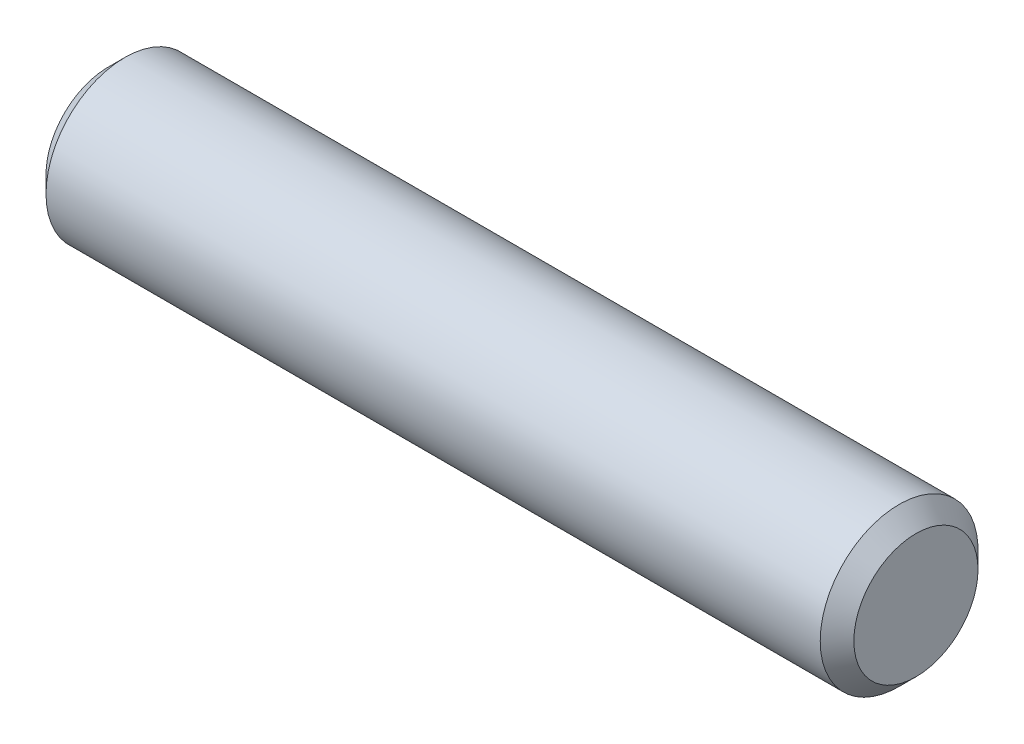
ISO-10303-21;
HEADER;
FILE_DESCRIPTION(('STEP AP214'),'2;1');
FILE_NAME('part.step','',(''),(''),'','','');
FILE_SCHEMA(('AUTOMOTIVE_DESIGN { 1 0 10303 214 1 1 1 1 }'));
ENDSEC;
DATA;
#1=APPLICATION_CONTEXT('core data for automotive mechanical design processes');
#2=APPLICATION_PROTOCOL_DEFINITION('international standard','automotive_design',2000,#1);
#3=PRODUCT_CONTEXT('',#1,'mechanical');
#4=PRODUCT('Part','Part','',(#3));
#5=PRODUCT_RELATED_PRODUCT_CATEGORY('part','',(#4));
#6=PRODUCT_DEFINITION_FORMATION('','',#4);
#7=PRODUCT_DEFINITION_CONTEXT('part definition',#1,'design');
#8=PRODUCT_DEFINITION('design','',#6,#7);
#9=PRODUCT_DEFINITION_SHAPE('','',#8);
#10=(LENGTH_UNIT() NAMED_UNIT(*) SI_UNIT(.MILLI.,.METRE.));
#11=(NAMED_UNIT(*) PLANE_ANGLE_UNIT() SI_UNIT($,.RADIAN.));
#12=(NAMED_UNIT(*) SI_UNIT($,.STERADIAN.) SOLID_ANGLE_UNIT());
#13=UNCERTAINTY_MEASURE_WITH_UNIT(LENGTH_MEASURE(1.E-05),#10,'distance_accuracy_value','');
#14=(GEOMETRIC_REPRESENTATION_CONTEXT(3) GLOBAL_UNCERTAINTY_ASSIGNED_CONTEXT((#13)) GLOBAL_UNIT_ASSIGNED_CONTEXT((#10,
#11,#12)) REPRESENTATION_CONTEXT('',''));
#15=CARTESIAN_POINT('',(0.,0.,0.));
#16=DIRECTION('',(0.,0.,1.));
#17=DIRECTION('',(1.,0.,0.));
#18=AXIS2_PLACEMENT_3D('',#15,#16,#17);
#19=CARTESIAN_POINT('',(6.096,0.,0.));
#20=DIRECTION('',(-1.,0.,0.));
#21=DIRECTION('',(0.,0.,1.));
#22=AXIS2_PLACEMENT_3D('',#19,#20,#21);
#23=CYLINDRICAL_SURFACE('',#22,1.190625);
#24=CARTESIAN_POINT('',(-5.84199999999999,0.,0.));
#25=DIRECTION('',(1.,0.,0.));
#26=DIRECTION('',(0.,0.,-1.));
#27=AXIS2_PLACEMENT_3D('',#24,#25,#26);
#28=CIRCLE('',#27,1.190625);
#29=CARTESIAN_POINT('',(-5.842,0.,1.190625));
#30=VERTEX_POINT('',#29);
#31=EDGE_CURVE('E380',#30,#30,#28,.T.);
#32=CARTESIAN_POINT('',(5.842,0.,0.));
#33=DIRECTION('',(1.,0.,0.));
#34=DIRECTION('',(0.,0.,-1.));
#35=AXIS2_PLACEMENT_3D('',#32,#33,#34);
#36=CIRCLE('',#35,1.190625);
#37=CARTESIAN_POINT('',(5.842,0.,1.190625));
#38=VERTEX_POINT('',#37);
#39=EDGE_CURVE('E384',#38,#38,#36,.F.);
#40=CARTESIAN_POINT('',(-5.842,0.,1.190625));
#41=CARTESIAN_POINT('',(-5.72029166666666,0.,1.190625));
#42=CARTESIAN_POINT('',(-5.59858333333333,0.,1.190625));
#43=CARTESIAN_POINT('',(-5.35516666666666,0.,1.190625));
#44=CARTESIAN_POINT('',(-5.23345833333333,0.,1.190625));
#45=CARTESIAN_POINT('',(-4.99004166666666,0.,1.190625));
#46=CARTESIAN_POINT('',(-4.86833333333333,0.,1.190625));
#47=CARTESIAN_POINT('',(-4.62491666666666,0.,1.190625));
#48=CARTESIAN_POINT('',(-4.50320833333333,0.,1.190625));
#49=CARTESIAN_POINT('',(-4.25979166666666,0.,1.190625));
#50=CARTESIAN_POINT('',(-4.13808333333333,0.,1.190625));
#51=CARTESIAN_POINT('',(-3.89466666666666,0.,1.190625));
#52=CARTESIAN_POINT('',(-3.77295833333333,0.,1.190625));
#53=CARTESIAN_POINT('',(-3.52954166666666,0.,1.190625));
#54=CARTESIAN_POINT('',(-3.40783333333333,0.,1.190625));
#55=CARTESIAN_POINT('',(-3.16441666666666,0.,1.190625));
#56=CARTESIAN_POINT('',(-3.04270833333333,0.,1.190625));
#57=CARTESIAN_POINT('',(-2.79929166666666,0.,1.190625));
#58=CARTESIAN_POINT('',(-2.67758333333333,0.,1.190625));
#59=CARTESIAN_POINT('',(-2.43416666666666,0.,1.190625));
#60=CARTESIAN_POINT('',(-2.31245833333333,0.,1.190625));
#61=CARTESIAN_POINT('',(-2.06904166666666,0.,1.190625));
#62=CARTESIAN_POINT('',(-1.94733333333333,0.,1.190625));
#63=CARTESIAN_POINT('',(-1.70391666666666,0.,1.190625));
#64=CARTESIAN_POINT('',(-1.58220833333333,0.,1.190625));
#65=CARTESIAN_POINT('',(-1.33879166666667,0.,1.190625));
#66=CARTESIAN_POINT('',(-1.21708333333333,0.,1.190625));
#67=CARTESIAN_POINT('',(-0.973666666666665,0.,1.190625));
#68=CARTESIAN_POINT('',(-0.851958333333332,0.,1.190625));
#69=CARTESIAN_POINT('',(-0.608541666666665,0.,1.190625));
#70=CARTESIAN_POINT('',(-0.486833333333332,0.,1.190625));
#71=CARTESIAN_POINT('',(-0.243416666666665,0.,1.190625));
#72=CARTESIAN_POINT('',(-0.121708333333332,0.,1.190625));
#73=CARTESIAN_POINT('',(0.121708333333335,0.,1.190625));
#74=CARTESIAN_POINT('',(0.243416666666668,0.,1.190625));
#75=CARTESIAN_POINT('',(0.486833333333335,0.,1.190625));
#76=CARTESIAN_POINT('',(0.608541666666668,0.,1.190625));
#77=CARTESIAN_POINT('',(0.851958333333335,0.,1.190625));
#78=CARTESIAN_POINT('',(0.973666666666668,0.,1.190625));
#79=CARTESIAN_POINT('',(1.21708333333334,0.,1.190625));
#80=CARTESIAN_POINT('',(1.33879166666667,0.,1.190625));
#81=CARTESIAN_POINT('',(1.58220833333333,0.,1.190625));
#82=CARTESIAN_POINT('',(1.70391666666667,0.,1.190625));
#83=CARTESIAN_POINT('',(1.94733333333333,0.,1.190625));
#84=CARTESIAN_POINT('',(2.06904166666667,0.,1.190625));
#85=CARTESIAN_POINT('',(2.31245833333333,0.,1.190625));
#86=CARTESIAN_POINT('',(2.43416666666667,0.,1.190625));
#87=CARTESIAN_POINT('',(2.67758333333333,0.,1.190625));
#88=CARTESIAN_POINT('',(2.79929166666667,0.,1.190625));
#89=CARTESIAN_POINT('',(3.04270833333333,0.,1.190625));
#90=CARTESIAN_POINT('',(3.16441666666667,0.,1.190625));
#91=CARTESIAN_POINT('',(3.40783333333333,0.,1.190625));
#92=CARTESIAN_POINT('',(3.52954166666667,0.,1.190625));
#93=CARTESIAN_POINT('',(3.77295833333333,0.,1.190625));
#94=CARTESIAN_POINT('',(3.89466666666667,0.,1.190625));
#95=CARTESIAN_POINT('',(4.13808333333333,0.,1.190625));
#96=CARTESIAN_POINT('',(4.25979166666667,0.,1.190625));
#97=CARTESIAN_POINT('',(4.50320833333333,0.,1.190625));
#98=CARTESIAN_POINT('',(4.62491666666667,0.,1.190625));
#99=CARTESIAN_POINT('',(4.86833333333333,0.,1.190625));
#100=CARTESIAN_POINT('',(4.99004166666667,0.,1.190625));
#101=CARTESIAN_POINT('',(5.23345833333333,0.,1.190625));
#102=CARTESIAN_POINT('',(5.35516666666667,0.,1.190625));
#103=CARTESIAN_POINT('',(5.59858333333333,0.,1.190625));
#104=CARTESIAN_POINT('',(5.72029166666667,0.,1.190625));
#105=CARTESIAN_POINT('',(5.842,0.,1.190625));
#106=B_SPLINE_CURVE_WITH_KNOTS('',3,(#40,#41,#42,#43,#44,#45,#46,#47,#48,#49,#50,#51,#52,#53,
#54,#55,#56,#57,#58,#59,#60,#61,#62,#63,#64,#65,#66,#67,#68,#69,#70,#71,#72,#73,#74,#75,#76,#77,
#78,#79,#80,#81,#82,#83,#84,#85,#86,#87,#88,#89,#90,#91,#92,#93,#94,#95,#96,#97,#98,#99,#100,
#101,#102,#103,#104,#105),.UNSPECIFIED.,.F.,.F.,(4,2,2,2,2,2,2,2,2,2,2,2,2,2,2,2,2,2,2,2,2,2,2,
2,2,2,2,2,2,2,2,2,4),(0.,0.365124999999999,0.73025,1.095375,1.4605,1.825625,2.19075,2.555875,
2.921,3.286125,3.65125,4.016375,4.3815,4.746625,5.11175,5.476875,5.842,6.207125,6.57225,
6.937375,7.3025,7.667625,8.03275,8.397875,8.76299999999999,9.128125,9.49324999999999,9.858375,
10.2235,10.588625,10.95375,11.318875,11.684),.UNSPECIFIED.);
#107=EDGE_CURVE('BSEAM370',#30,#38,#106,.T.);
#108=ORIENTED_EDGE('',*,*,#31,.T.);
#109=ORIENTED_EDGE('',*,*,#39,.T.);
#110=ORIENTED_EDGE('',*,*,#107,.T.);
#111=ORIENTED_EDGE('',*,*,#107,.F.);
#112=EDGE_LOOP('',(#108,#110,#109,#111));
#113=FACE_BOUND('',#112,.T.);
#114=ADVANCED_FACE('F370',(#113),#23,.T.);
#115=CARTESIAN_POINT('',(6.096,0.,0.));
#116=DIRECTION('',(1.,0.,0.));
#117=DIRECTION('',(0.,0.,-1.));
#118=AXIS2_PLACEMENT_3D('',#115,#116,#117);
#119=PLANE('',#118);
#120=CARTESIAN_POINT('',(6.096,0.,0.));
#121=DIRECTION('',(1.,0.,0.));
#122=DIRECTION('',(0.,0.,-1.));
#123=AXIS2_PLACEMENT_3D('',#120,#121,#122);
#124=CIRCLE('',#123,0.936625000000001);
#125=CARTESIAN_POINT('',(6.096,0.,-0.936625000000001));
#126=VERTEX_POINT('',#125);
#127=EDGE_CURVE('E10',#126,#126,#124,.T.);
#128=ORIENTED_EDGE('',*,*,#127,.T.);
#129=EDGE_LOOP('',(#128));
#130=FACE_BOUND('',#129,.T.);
#131=ADVANCED_FACE('F403',(#130),#119,.T.);
#132=CARTESIAN_POINT('',(-6.096,0.,0.));
#133=DIRECTION('',(1.,0.,0.));
#134=DIRECTION('',(0.,0.,-1.));
#135=AXIS2_PLACEMENT_3D('',#132,#133,#134);
#136=PLANE('',#135);
#137=CARTESIAN_POINT('',(-6.096,0.,0.));
#138=DIRECTION('',(1.,0.,0.));
#139=DIRECTION('',(0.,0.,-1.));
#140=AXIS2_PLACEMENT_3D('',#137,#138,#139);
#141=CIRCLE('',#140,0.936624999999995);
#142=CARTESIAN_POINT('',(-6.096,0.,-0.936624999999995));
#143=VERTEX_POINT('',#142);
#144=EDGE_CURVE('E376',#143,#143,#141,.F.);
#145=ORIENTED_EDGE('',*,*,#144,.T.);
#146=EDGE_LOOP('',(#145));
#147=FACE_BOUND('',#146,.T.);
#148=ADVANCED_FACE('F399',(#147),#136,.F.);
#149=CARTESIAN_POINT('',(-5.84199999999999,0.,0.));
#150=DIRECTION('',(1.,0.,0.));
#151=DIRECTION('',(0.,0.,-1.));
#152=AXIS2_PLACEMENT_3D('',#149,#150,#151);
#153=CONICAL_SURFACE('',#152,1.190625,0.785398163397447);
#154=ORIENTED_EDGE('',*,*,#144,.F.);
#155=EDGE_LOOP('',(#154));
#156=FACE_BOUND('',#155,.T.);
#157=ORIENTED_EDGE('',*,*,#31,.F.);
#158=EDGE_LOOP('',(#157));
#159=FACE_BOUND('',#158,.T.);
#160=ADVANCED_FACE('F394',(#156,#159),#153,.T.);
#161=CARTESIAN_POINT('',(6.096,0.,0.));
#162=DIRECTION('',(-1.,0.,0.));
#163=DIRECTION('',(0.,0.,1.));
#164=AXIS2_PLACEMENT_3D('',#161,#162,#163);
#165=CONICAL_SURFACE('',#164,0.936625000000001,0.785398163397446);
#166=ORIENTED_EDGE('',*,*,#39,.F.);
#167=EDGE_LOOP('',(#166));
#168=FACE_BOUND('',#167,.T.);
#169=ORIENTED_EDGE('',*,*,#127,.F.);
#170=EDGE_LOOP('',(#169));
#171=FACE_BOUND('',#170,.T.);
#172=ADVANCED_FACE('F391',(#168,#171),#165,.T.);
#173=CLOSED_SHELL('',(#114,#131,#148,#160,#172));
#174=MANIFOLD_SOLID_BREP('B2',#173);
#175=ADVANCED_BREP_SHAPE_REPRESENTATION('',(#18,#174),#14);
#176=SHAPE_DEFINITION_REPRESENTATION(#9,#175);
ENDSEC;
END-ISO-10303-21;
